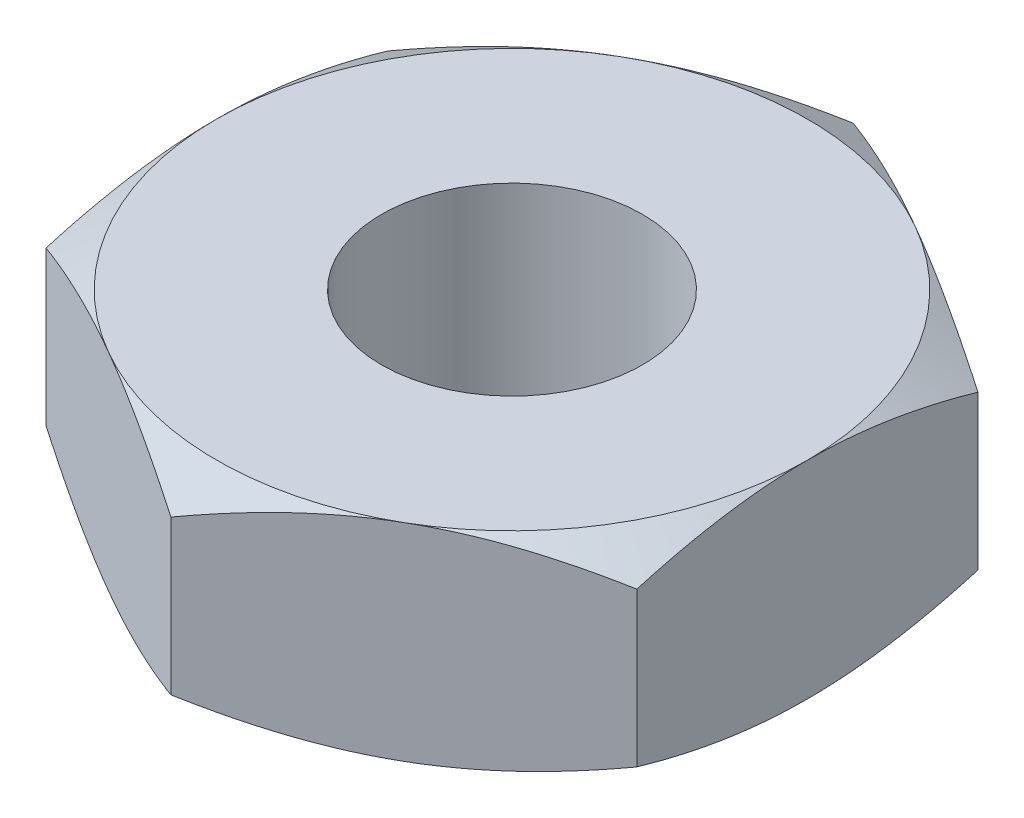
ISO-10303-21;
HEADER;
FILE_DESCRIPTION(('STEP AP214'),'2;1');
FILE_NAME('part.step','',(''),(''),'','','');
FILE_SCHEMA(('AUTOMOTIVE_DESIGN { 1 0 10303 214 1 1 1 1 }'));
ENDSEC;
DATA;
#1=APPLICATION_CONTEXT('core data for automotive mechanical design processes');
#2=APPLICATION_PROTOCOL_DEFINITION('international standard','automotive_design',2000,#1);
#3=PRODUCT_CONTEXT('',#1,'mechanical');
#4=PRODUCT('Part','Part','',(#3));
#5=PRODUCT_RELATED_PRODUCT_CATEGORY('part','',(#4));
#6=PRODUCT_DEFINITION_FORMATION('','',#4);
#7=PRODUCT_DEFINITION_CONTEXT('part definition',#1,'design');
#8=PRODUCT_DEFINITION('design','',#6,#7);
#9=PRODUCT_DEFINITION_SHAPE('','',#8);
#10=(LENGTH_UNIT() NAMED_UNIT(*) SI_UNIT(.MILLI.,.METRE.));
#11=(NAMED_UNIT(*) PLANE_ANGLE_UNIT() SI_UNIT($,.RADIAN.));
#12=(NAMED_UNIT(*) SI_UNIT($,.STERADIAN.) SOLID_ANGLE_UNIT());
#13=UNCERTAINTY_MEASURE_WITH_UNIT(LENGTH_MEASURE(1.E-05),#10,'distance_accuracy_value','');
#14=(GEOMETRIC_REPRESENTATION_CONTEXT(3) GLOBAL_UNCERTAINTY_ASSIGNED_CONTEXT((#13)) GLOBAL_UNIT_ASSIGNED_CONTEXT((#10,
#11,#12)) REPRESENTATION_CONTEXT('',''));
#15=CARTESIAN_POINT('',(0.,0.,0.));
#16=DIRECTION('',(0.,0.,1.));
#17=DIRECTION('',(1.,0.,0.));
#18=AXIS2_PLACEMENT_3D('',#15,#16,#17);
#19=CARTESIAN_POINT('',(-3.96875,1.3890625,-2.29135888084633));
#20=DIRECTION('',(0.,1.,0.));
#21=DIRECTION('',(0.,0.,1.));
#22=AXIS2_PLACEMENT_3D('',#19,#20,#21);
#23=PLANE('',#22);
#24=CARTESIAN_POINT('',(0.,1.3890625,0.));
#25=DIRECTION('',(0.,1.,0.));
#26=DIRECTION('',(0.,0.,1.));
#27=AXIS2_PLACEMENT_3D('',#24,#25,#26);
#28=CIRCLE('',#27,1.7526);
#29=CARTESIAN_POINT('',(0.,1.3890625,1.7526));
#30=VERTEX_POINT('',#29);
#31=EDGE_CURVE('E247',#30,#30,#28,.T.);
#32=ORIENTED_EDGE('',*,*,#31,.F.);
#33=EDGE_LOOP('',(#32));
#34=FACE_BOUND('',#33,.T.);
#35=CARTESIAN_POINT('',(0.,1.3890625,0.));
#36=DIRECTION('',(0.,1.,0.));
#37=DIRECTION('',(0.,0.,1.));
#38=AXIS2_PLACEMENT_3D('',#35,#36,#37);
#39=CIRCLE('',#38,3.96875);
#40=CARTESIAN_POINT('',(-1.984375,1.3890625,3.43703832126949));
#41=VERTEX_POINT('',#40);
#42=CARTESIAN_POINT('',(1.984375,1.3890625,3.43703832126949));
#43=VERTEX_POINT('',#42);
#44=EDGE_CURVE('E306',#41,#43,#39,.T.);
#45=ORIENTED_EDGE('',*,*,#44,.T.);
#46=CARTESIAN_POINT('',(3.96875,1.3890625,0.));
#47=VERTEX_POINT('',#46);
#48=EDGE_CURVE('E309',#43,#47,#39,.T.);
#49=ORIENTED_EDGE('',*,*,#48,.T.);
#50=CARTESIAN_POINT('',(1.984375,1.3890625,-3.43703832126949));
#51=VERTEX_POINT('',#50);
#52=EDGE_CURVE('E316',#47,#51,#39,.T.);
#53=ORIENTED_EDGE('',*,*,#52,.T.);
#54=CARTESIAN_POINT('',(-1.984375,1.3890625,-3.43703832126949));
#55=VERTEX_POINT('',#54);
#56=EDGE_CURVE('E320',#51,#55,#39,.T.);
#57=ORIENTED_EDGE('',*,*,#56,.T.);
#58=CARTESIAN_POINT('',(-3.96875,1.3890625,0.));
#59=VERTEX_POINT('',#58);
#60=EDGE_CURVE('E313',#55,#59,#39,.T.);
#61=ORIENTED_EDGE('',*,*,#60,.T.);
#62=EDGE_CURVE('E308',#59,#41,#39,.T.);
#63=ORIENTED_EDGE('',*,*,#62,.T.);
#64=EDGE_LOOP('',(#45,#49,#53,#57,#61,#63));
#65=FACE_BOUND('',#64,.T.);
#66=ADVANCED_FACE('F43',(#34,#65),#23,.T.);
#67=CARTESIAN_POINT('',(0.,1.3890625,-4.58271776169266));
#68=DIRECTION('',(0.5,0.,0.866025403784438));
#69=DIRECTION('',(0.866025403784439,0.,-0.5));
#70=AXIS2_PLACEMENT_3D('',#67,#68,#69);
#71=PLANE('',#70);
#72=DIRECTION('',(0.,-1.,0.));
#73=VECTOR('',#72,1.);
#74=CARTESIAN_POINT('',(0.,1.3890625,-4.58271776169266));
#75=LINE('',#74,#73);
#76=CARTESIAN_POINT('',(0.,1.034588047513,-4.58271776169266));
#77=VERTEX_POINT('',#76);
#78=CARTESIAN_POINT('',(0.,-1.034588047513,-4.58271776169266));
#79=VERTEX_POINT('',#78);
#80=EDGE_CURVE('E244',#77,#79,#75,.T.);
#81=ORIENTED_EDGE('',*,*,#80,.T.);
#82=CARTESIAN_POINT('',(0.000199999999994845,-1.03452137832671,-4.58283323174649));
#83=CARTESIAN_POINT('',(-0.174205902081162,-1.09267788164553,-4.48213993723168));
#84=CARTESIAN_POINT('',(-0.350117265982856,-1.14556901401833,-4.38057746392952));
#85=CARTESIAN_POINT('',(-0.704986056512743,-1.23789081645719,-4.17569387219009));
#86=CARTESIAN_POINT('',(-0.883949788458087,-1.27728882681341,-4.07236911337627));
#87=CARTESIAN_POINT('',(-1.23965934318176,-1.3386172964786,-3.86700010620323));
#88=CARTESIAN_POINT('',(-1.41635043707329,-1.36095593380879,-3.76498745558155));
#89=CARTESIAN_POINT('',(-1.7705639777928,-1.38762315750667,-3.56048217249653));
#90=CARTESIAN_POINT('',(-1.94808513722976,-1.39197382713073,-3.45799028330875));
#91=CARTESIAN_POINT('',(-2.27979074080338,-1.38292085025305,-3.26647996379381));
#92=CARTESIAN_POINT('',(-2.43402485076553,-1.37174001600782,-3.17743285888894));
#93=CARTESIAN_POINT('',(-2.74148824092523,-1.33630397944562,-2.99991878781428));
#94=CARTESIAN_POINT('',(-2.89471645773984,-1.31203667319011,-2.91145243558892));
#95=CARTESIAN_POINT('',(-3.20281373181354,-1.25137053864588,-2.73357239146588));
#96=CARTESIAN_POINT('',(-3.35764379626361,-1.21471455942136,-2.64418121207699));
#97=CARTESIAN_POINT('',(-3.66499472649982,-1.13151999862476,-2.46673206976942));
#98=CARTESIAN_POINT('',(-3.81751952962953,-1.08500096376703,-2.37867183362439));
#99=CARTESIAN_POINT('',(-3.96895,-1.03452137832671,-2.29124341079249));
#100=B_SPLINE_CURVE_WITH_KNOTS('',3,(#82,#83,#84,#85,#86,#87,#88,#89,#90,#91,#92,#93,#94,#95,
#96,#97,#98,#99),.UNSPECIFIED.,.F.,.F.,(4,2,2,2,2,2,2,2,4),(0.,0.629094460519772,
1.25970103886327,1.87470051579827,2.48894475282133,3.02377031984306,3.55909140824994,
4.1062865060967,4.65240713705191),.UNSPECIFIED.);
#101=CARTESIAN_POINT('',(-1.984375,-1.3890625,-3.43703832126949));
#102=VERTEX_POINT('',#101);
#103=EDGE_CURVE('E66',#79,#102,#100,.T.);
#104=ORIENTED_EDGE('',*,*,#103,.T.);
#105=CARTESIAN_POINT('',(-3.96875,-1.03458804751317,-2.2913588808466));
#106=VERTEX_POINT('',#105);
#107=EDGE_CURVE('E202',#102,#106,#100,.T.);
#108=ORIENTED_EDGE('',*,*,#107,.T.);
#109=DIRECTION('',(0.,-1.,0.));
#110=VECTOR('',#109,1.);
#111=CARTESIAN_POINT('',(-3.96875,1.3890625,-2.29135888084633));
#112=LINE('',#111,#110);
#113=CARTESIAN_POINT('',(-3.96875,1.03458804751317,-2.2913588808466));
#114=VERTEX_POINT('',#113);
#115=EDGE_CURVE('E232',#114,#106,#112,.T.);
#116=ORIENTED_EDGE('',*,*,#115,.F.);
#117=CARTESIAN_POINT('',(0.000199999999994845,1.03452137832671,-4.58283323174649));
#118=CARTESIAN_POINT('',(-0.174205902081162,1.09267788164553,-4.48213993723168));
#119=CARTESIAN_POINT('',(-0.350117265982856,1.14556901401833,-4.38057746392952));
#120=CARTESIAN_POINT('',(-0.704986056512743,1.23789081645719,-4.17569387219009));
#121=CARTESIAN_POINT('',(-0.883949788458087,1.27728882681341,-4.07236911337627));
#122=CARTESIAN_POINT('',(-1.23965934318176,1.3386172964786,-3.86700010620323));
#123=CARTESIAN_POINT('',(-1.41635043707329,1.36095593380879,-3.76498745558155));
#124=CARTESIAN_POINT('',(-1.7705639777928,1.38762315750667,-3.56048217249653));
#125=CARTESIAN_POINT('',(-1.94808513722976,1.39197382713073,-3.45799028330875));
#126=CARTESIAN_POINT('',(-2.27979074080338,1.38292085025305,-3.26647996379381));
#127=CARTESIAN_POINT('',(-2.43402485076553,1.37174001600782,-3.17743285888894));
#128=CARTESIAN_POINT('',(-2.74148824092523,1.33630397944562,-2.99991878781428));
#129=CARTESIAN_POINT('',(-2.89471645773984,1.31203667319011,-2.91145243558892));
#130=CARTESIAN_POINT('',(-3.20281373181354,1.25137053864588,-2.73357239146588));
#131=CARTESIAN_POINT('',(-3.35764379626361,1.21471455942136,-2.64418121207699));
#132=CARTESIAN_POINT('',(-3.66499472649982,1.13151999862476,-2.46673206976942));
#133=CARTESIAN_POINT('',(-3.81751952962953,1.08500096376703,-2.37867183362439));
#134=CARTESIAN_POINT('',(-3.96895,1.03452137832671,-2.29124341079249));
#135=B_SPLINE_CURVE_WITH_KNOTS('',3,(#117,#118,#119,#120,#121,#122,#123,#124,#125,#126,#127,
#128,#129,#130,#131,#132,#133,#134),.UNSPECIFIED.,.F.,.F.,(4,2,2,2,2,2,2,2,4),(0.,
0.629094460519772,1.25970103886327,1.87470051579827,2.48894475282133,3.02377031984306,
3.55909140824994,4.1062865060967,4.65240713705191),.UNSPECIFIED.);
#136=EDGE_CURVE('E254',#55,#114,#135,.T.);
#137=ORIENTED_EDGE('',*,*,#136,.F.);
#138=EDGE_CURVE('E251',#77,#55,#135,.T.);
#139=ORIENTED_EDGE('',*,*,#138,.F.);
#140=EDGE_LOOP('',(#81,#104,#108,#116,#137,#139));
#141=FACE_BOUND('',#140,.T.);
#142=ADVANCED_FACE('F45',(#141),#71,.F.);
#143=CARTESIAN_POINT('',(-3.96875,1.3890625,-2.29135888084633));
#144=DIRECTION('',(1.,0.,0.));
#145=DIRECTION('',(0.,0.,-1.));
#146=AXIS2_PLACEMENT_3D('',#143,#144,#145);
#147=PLANE('',#146);
#148=ORIENTED_EDGE('',*,*,#115,.T.);
#149=CARTESIAN_POINT('',(-3.96875,0.580270643707876,-6.22169695676346));
#150=CARTESIAN_POINT('',(-3.96875,0.495629554498547,-6.04776097042012));
#151=CARTESIAN_POINT('',(-3.96875,0.411781015228386,-5.87343276197247));
#152=CARTESIAN_POINT('',(-3.96875,0.246113557528974,-5.52378352626055));
#153=CARTESIAN_POINT('',(-3.96875,0.164294946503744,-5.34846235350417));
#154=CARTESIAN_POINT('',(-3.96875,0.00273455510915232,-4.99574743703183));
#155=CARTESIAN_POINT('',(-3.96875,-0.0769940637955178,-4.8183476443733));
#156=CARTESIAN_POINT('',(-3.96875,-0.233275940637595,-4.46216001234746));
#157=CARTESIAN_POINT('',(-3.96875,-0.309829344353899,-4.28337223715292));
#158=CARTESIAN_POINT('',(-3.96875,-0.461404283867796,-3.91814940793921));
#159=CARTESIAN_POINT('',(-3.96875,-0.536290207564717,-3.7316577704564));
#160=CARTESIAN_POINT('',(-3.96875,-0.680554504087907,-3.35651758495646));
#161=CARTESIAN_POINT('',(-3.96875,-0.74993226847017,-3.16786880128179));
#162=CARTESIAN_POINT('',(-3.96875,-0.881408126224332,-2.78844599514931));
#163=CARTESIAN_POINT('',(-3.96875,-0.943520384294775,-2.59767692965097));
#164=CARTESIAN_POINT('',(-3.96875,-1.05851662121305,-2.2134031112067));
#165=CARTESIAN_POINT('',(-3.96875,-1.11140343580595,-2.01989921874075));
#166=CARTESIAN_POINT('',(-3.96875,-1.20517636129246,-1.6311091012753));
#167=CARTESIAN_POINT('',(-3.96875,-1.24612852574059,-1.43583910195992));
#168=CARTESIAN_POINT('',(-3.96875,-1.31375702721554,-1.0428024899618));
#169=CARTESIAN_POINT('',(-3.96875,-1.34043487467902,-0.845036143697719));
#170=CARTESIAN_POINT('',(-3.96875,-1.3770403841221,-0.450605512338849));
#171=CARTESIAN_POINT('',(-3.96875,-1.38718865783126,-0.25396221985486));
#172=CARTESIAN_POINT('',(-3.96875,-1.39045976447106,0.139485992218314));
#173=CARTESIAN_POINT('',(-3.96875,-1.38358228756796,0.336290914683681));
#174=CARTESIAN_POINT('',(-3.96875,-1.35810261812635,0.668410754752709));
#175=CARTESIAN_POINT('',(-3.96875,-1.3437432404343,0.804072537555574));
#176=CARTESIAN_POINT('',(-3.96875,-1.30779247207964,1.0744408102038));
#177=CARTESIAN_POINT('',(-3.96875,-1.28620015652866,1.2091471756276));
#178=CARTESIAN_POINT('',(-3.96875,-1.21170483065242,1.61162887315064));
#179=CARTESIAN_POINT('',(-3.96875,-1.14909538893366,1.87762972847311));
#180=CARTESIAN_POINT('',(-3.96875,-1.04002741153514,2.27555191163834));
#181=CARTESIAN_POINT('',(-3.96875,-1.00061037701119,2.40952100703487));
#182=CARTESIAN_POINT('',(-3.96875,-0.917560151569726,2.67615857994853));
#183=CARTESIAN_POINT('',(-3.96875,-0.873926928994568,2.80882704769153));
#184=CARTESIAN_POINT('',(-3.96875,-0.783154734396828,3.07290448457615));
#185=CARTESIAN_POINT('',(-3.96875,-0.736016795290461,3.20431381202589));
#186=CARTESIAN_POINT('',(-3.96875,-0.638802011642293,3.46603416335526));
#187=CARTESIAN_POINT('',(-3.96875,-0.588725228974447,3.5963452102919));
#188=CARTESIAN_POINT('',(-3.96875,-0.452575047627679,3.94088412858893));
#189=CARTESIAN_POINT('',(-3.96875,-0.364374104411038,4.15427038484707));
#190=CARTESIAN_POINT('',(-3.96875,-0.182946985149719,4.57890352123334));
#191=CARTESIAN_POINT('',(-3.96875,-0.0897202959000215,4.79015018024977));
#192=CARTESIAN_POINT('',(-3.96875,0.100589836396979,5.21097578363183));
#193=CARTESIAN_POINT('',(-3.96875,0.197674518443246,5.42055416586365));
#194=CARTESIAN_POINT('',(-3.96875,0.394806200491002,5.83831597781125));
#195=CARTESIAN_POINT('',(-3.96875,0.494853286808515,6.04649936666375));
#196=CARTESIAN_POINT('',(-3.96875,0.69742165401802,6.4620401593694));
#197=CARTESIAN_POINT('',(-3.96875,0.799946395513734,6.66939587286292));
#198=CARTESIAN_POINT('',(-3.96875,1.00685664462163,7.083177791462));
#199=CARTESIAN_POINT('',(-3.96875,1.11124217149255,7.2896039869195));
#200=CARTESIAN_POINT('',(-3.96875,1.42658702639339,7.90765670661576));
#201=CARTESIAN_POINT('',(-3.96875,1.63977745980659,8.3181443926152));
#202=CARTESIAN_POINT('',(-3.96875,2.04807122962612,9.09498840679135));
#203=CARTESIAN_POINT('',(-3.96875,2.24278532373392,9.46155029736983));
#204=CARTESIAN_POINT('',(-3.96875,2.63459143839332,10.1934273187956));
#205=CARTESIAN_POINT('',(-3.96875,2.83168359443524,10.5587423770687));
#206=CARTESIAN_POINT('',(-3.96875,3.22699755433617,11.2872403110954));
#207=CARTESIAN_POINT('',(-3.96875,3.42521369250251,11.6504262661362));
#208=CARTESIAN_POINT('',(-3.96875,3.82300419769019,12.3760186060547));
#209=CARTESIAN_POINT('',(-3.96875,4.02257846210828,12.7384250471593));
#210=CARTESIAN_POINT('',(-3.96875,4.22264849263489,13.1005558551109));
#211=B_SPLINE_CURVE_WITH_KNOTS('',3,(#149,#150,#151,#152,#153,#154,#155,#156,#157,#158,#159,
#160,#161,#162,#163,#164,#165,#166,#167,#168,#169,#170,#171,#172,#173,#174,#175,#176,#177,#178,
#179,#180,#181,#182,#183,#184,#185,#186,#187,#188,#189,#190,#191,#192,#193,#194,#195,#196,#197,
#198,#199,#200,#201,#202,#203,#204,#205,#206,#207,#208,#209,#210),.UNSPECIFIED.,.F.,.F.,(4,2,2,
2,2,2,2,2,2,2,2,2,2,2,2,2,2,2,2,2,2,2,2,2,2,2,2,2,2,2,4),(0.,0.580317532576746,1.16072241618541,
1.74417501419442,2.32760079530033,2.93042926439164,3.53332423092783,4.13502349111168,
4.73653747196744,5.33465617674795,5.93271157908309,6.52271762195252,7.11273440180051,
7.52179616412227,7.93091025386496,8.74954934292227,9.16845446095108,9.58736272461322,
10.006148012592,10.4249244866913,11.1175183219819,11.8101830160883,12.5030719870989,
13.1959811668256,13.8899215612348,14.5838691419566,15.9714733438239,17.2166675132063,
18.4619329658364,19.7031966118937,20.9443675020377),.UNSPECIFIED.);
#212=CARTESIAN_POINT('',(-3.96875,-1.3890625,0.));
#213=VERTEX_POINT('',#212);
#214=EDGE_CURVE('E287',#106,#213,#211,.T.);
#215=ORIENTED_EDGE('',*,*,#214,.T.);
#216=CARTESIAN_POINT('',(-3.96875,-1.034588047513,2.29135888084633));
#217=VERTEX_POINT('',#216);
#218=EDGE_CURVE('E281',#213,#217,#211,.T.);
#219=ORIENTED_EDGE('',*,*,#218,.T.);
#220=DIRECTION('',(0.,-1.,0.));
#221=VECTOR('',#220,1.);
#222=CARTESIAN_POINT('',(-3.96875,1.3890625,2.29135888084633));
#223=LINE('',#222,#221);
#224=CARTESIAN_POINT('',(-3.96875,1.034588047513,2.29135888084633));
#225=VERTEX_POINT('',#224);
#226=EDGE_CURVE('E235',#225,#217,#223,.T.);
#227=ORIENTED_EDGE('',*,*,#226,.F.);
#228=CARTESIAN_POINT('',(-3.96875,-0.580270643707876,-6.22169695676346));
#229=CARTESIAN_POINT('',(-3.96875,-0.495629554498547,-6.04776097042012));
#230=CARTESIAN_POINT('',(-3.96875,-0.411781015228386,-5.87343276197247));
#231=CARTESIAN_POINT('',(-3.96875,-0.246113557528974,-5.52378352626055));
#232=CARTESIAN_POINT('',(-3.96875,-0.164294946503744,-5.34846235350417));
#233=CARTESIAN_POINT('',(-3.96875,-0.00273455510915232,-4.99574743703183));
#234=CARTESIAN_POINT('',(-3.96875,0.0769940637955178,-4.8183476443733));
#235=CARTESIAN_POINT('',(-3.96875,0.233275940637595,-4.46216001234746));
#236=CARTESIAN_POINT('',(-3.96875,0.309829344353899,-4.28337223715292));
#237=CARTESIAN_POINT('',(-3.96875,0.461404283867796,-3.91814940793921));
#238=CARTESIAN_POINT('',(-3.96875,0.536290207564717,-3.7316577704564));
#239=CARTESIAN_POINT('',(-3.96875,0.680554504087907,-3.35651758495646));
#240=CARTESIAN_POINT('',(-3.96875,0.74993226847017,-3.16786880128179));
#241=CARTESIAN_POINT('',(-3.96875,0.881408126224332,-2.78844599514931));
#242=CARTESIAN_POINT('',(-3.96875,0.943520384294775,-2.59767692965097));
#243=CARTESIAN_POINT('',(-3.96875,1.05851662121305,-2.2134031112067));
#244=CARTESIAN_POINT('',(-3.96875,1.11140343580595,-2.01989921874075));
#245=CARTESIAN_POINT('',(-3.96875,1.20517636129246,-1.6311091012753));
#246=CARTESIAN_POINT('',(-3.96875,1.24612852574059,-1.43583910195992));
#247=CARTESIAN_POINT('',(-3.96875,1.31375702721554,-1.0428024899618));
#248=CARTESIAN_POINT('',(-3.96875,1.34043487467902,-0.845036143697719));
#249=CARTESIAN_POINT('',(-3.96875,1.3770403841221,-0.450605512338849));
#250=CARTESIAN_POINT('',(-3.96875,1.38718865783126,-0.25396221985486));
#251=CARTESIAN_POINT('',(-3.96875,1.39045976447106,0.139485992218314));
#252=CARTESIAN_POINT('',(-3.96875,1.38358228756796,0.336290914683681));
#253=CARTESIAN_POINT('',(-3.96875,1.35810261812635,0.668410754752709));
#254=CARTESIAN_POINT('',(-3.96875,1.3437432404343,0.804072537555574));
#255=CARTESIAN_POINT('',(-3.96875,1.30779247207964,1.0744408102038));
#256=CARTESIAN_POINT('',(-3.96875,1.28620015652866,1.2091471756276));
#257=CARTESIAN_POINT('',(-3.96875,1.21170483065242,1.61162887315064));
#258=CARTESIAN_POINT('',(-3.96875,1.14909538893366,1.87762972847311));
#259=CARTESIAN_POINT('',(-3.96875,1.04002741153514,2.27555191163834));
#260=CARTESIAN_POINT('',(-3.96875,1.00061037701119,2.40952100703487));
#261=CARTESIAN_POINT('',(-3.96875,0.917560151569726,2.67615857994853));
#262=CARTESIAN_POINT('',(-3.96875,0.873926928994568,2.80882704769153));
#263=CARTESIAN_POINT('',(-3.96875,0.783154734396828,3.07290448457615));
#264=CARTESIAN_POINT('',(-3.96875,0.736016795290461,3.20431381202589));
#265=CARTESIAN_POINT('',(-3.96875,0.638802011642293,3.46603416335526));
#266=CARTESIAN_POINT('',(-3.96875,0.588725228974447,3.5963452102919));
#267=CARTESIAN_POINT('',(-3.96875,0.452575047627679,3.94088412858893));
#268=CARTESIAN_POINT('',(-3.96875,0.364374104411038,4.15427038484707));
#269=CARTESIAN_POINT('',(-3.96875,0.182946985149719,4.57890352123334));
#270=CARTESIAN_POINT('',(-3.96875,0.0897202959000215,4.79015018024977));
#271=CARTESIAN_POINT('',(-3.96875,-0.100589836396979,5.21097578363183));
#272=CARTESIAN_POINT('',(-3.96875,-0.197674518443246,5.42055416586365));
#273=CARTESIAN_POINT('',(-3.96875,-0.394806200491002,5.83831597781125));
#274=CARTESIAN_POINT('',(-3.96875,-0.494853286808515,6.04649936666375));
#275=CARTESIAN_POINT('',(-3.96875,-0.69742165401802,6.4620401593694));
#276=CARTESIAN_POINT('',(-3.96875,-0.799946395513734,6.66939587286292));
#277=CARTESIAN_POINT('',(-3.96875,-1.00685664462163,7.083177791462));
#278=CARTESIAN_POINT('',(-3.96875,-1.11124217149255,7.2896039869195));
#279=CARTESIAN_POINT('',(-3.96875,-1.42658702639339,7.90765670661576));
#280=CARTESIAN_POINT('',(-3.96875,-1.63977745980659,8.3181443926152));
#281=CARTESIAN_POINT('',(-3.96875,-2.04807122962612,9.09498840679135));
#282=CARTESIAN_POINT('',(-3.96875,-2.24278532373392,9.46155029736983));
#283=CARTESIAN_POINT('',(-3.96875,-2.63459143839332,10.1934273187956));
#284=CARTESIAN_POINT('',(-3.96875,-2.83168359443524,10.5587423770687));
#285=CARTESIAN_POINT('',(-3.96875,-3.22699755433617,11.2872403110954));
#286=CARTESIAN_POINT('',(-3.96875,-3.42521369250251,11.6504262661362));
#287=CARTESIAN_POINT('',(-3.96875,-3.82300419769019,12.3760186060547));
#288=CARTESIAN_POINT('',(-3.96875,-4.02257846210828,12.7384250471593));
#289=CARTESIAN_POINT('',(-3.96875,-4.22264849263489,13.1005558551109));
#290=B_SPLINE_CURVE_WITH_KNOTS('',3,(#228,#229,#230,#231,#232,#233,#234,#235,#236,#237,#238,
#239,#240,#241,#242,#243,#244,#245,#246,#247,#248,#249,#250,#251,#252,#253,#254,#255,#256,#257,
#258,#259,#260,#261,#262,#263,#264,#265,#266,#267,#268,#269,#270,#271,#272,#273,#274,#275,#276,
#277,#278,#279,#280,#281,#282,#283,#284,#285,#286,#287,#288,#289),.UNSPECIFIED.,.F.,.F.,(4,2,2,
2,2,2,2,2,2,2,2,2,2,2,2,2,2,2,2,2,2,2,2,2,2,2,2,2,2,2,4),(0.,0.580317532576746,1.16072241618541,
1.74417501419442,2.32760079530033,2.93042926439164,3.53332423092783,4.13502349111168,
4.73653747196744,5.33465617674795,5.93271157908309,6.52271762195252,7.11273440180051,
7.52179616412227,7.93091025386496,8.74954934292227,9.16845446095108,9.58736272461322,
10.006148012592,10.4249244866913,11.1175183219819,11.8101830160883,12.5030719870989,
13.1959811668256,13.8899215612348,14.5838691419566,15.9714733438239,17.2166675132063,
18.4619329658364,19.7031966118937,20.9443675020377),.UNSPECIFIED.);
#291=EDGE_CURVE('E261',#59,#225,#290,.T.);
#292=ORIENTED_EDGE('',*,*,#291,.F.);
#293=EDGE_CURVE('E260',#114,#59,#290,.T.);
#294=ORIENTED_EDGE('',*,*,#293,.F.);
#295=EDGE_LOOP('',(#148,#215,#219,#227,#292,#294));
#296=FACE_BOUND('',#295,.T.);
#297=ADVANCED_FACE('F274',(#296),#147,.F.);
#298=CARTESIAN_POINT('',(-3.96875,1.3890625,2.29135888084633));
#299=DIRECTION('',(0.5,0.,-0.866025403784439));
#300=DIRECTION('',(-0.866025403784439,0.,-0.5));
#301=AXIS2_PLACEMENT_3D('',#298,#299,#300);
#302=PLANE('',#301);
#303=ORIENTED_EDGE('',*,*,#226,.T.);
#304=CARTESIAN_POINT('',(-3.96895,-1.03452137832671,2.29124341079249));
#305=CARTESIAN_POINT('',(-3.79454409791885,-1.09267788164553,2.39193670530731));
#306=CARTESIAN_POINT('',(-3.61863273401715,-1.14556901401833,2.49349917860946));
#307=CARTESIAN_POINT('',(-3.26376394348726,-1.23789081645719,2.69838277034889));
#308=CARTESIAN_POINT('',(-3.08480021154192,-1.27728882681341,2.80170752916271));
#309=CARTESIAN_POINT('',(-2.72909065681824,-1.3386172964786,3.00707653633575));
#310=CARTESIAN_POINT('',(-2.55239956292672,-1.36095593380879,3.10908918695743));
#311=CARTESIAN_POINT('',(-2.1981860222072,-1.38762315750667,3.31359447004246));
#312=CARTESIAN_POINT('',(-2.02066486277025,-1.39197382713073,3.41608635923024));
#313=CARTESIAN_POINT('',(-1.68895925919662,-1.38292085025305,3.60759667874518));
#314=CARTESIAN_POINT('',(-1.53472514923448,-1.37174001600782,3.69664378365004));
#315=CARTESIAN_POINT('',(-1.22726175907478,-1.33630397944562,3.8741578547247));
#316=CARTESIAN_POINT('',(-1.07403354226016,-1.31203667319011,3.96262420695006));
#317=CARTESIAN_POINT('',(-0.765936268186465,-1.25137053864589,4.1405042510731));
#318=CARTESIAN_POINT('',(-0.611106203736397,-1.21471455942136,4.229895430462));
#319=CARTESIAN_POINT('',(-0.303755273500178,-1.13151999862476,4.40734457276956));
#320=CARTESIAN_POINT('',(-0.151230470370471,-1.08500096376704,4.49540480891459));
#321=CARTESIAN_POINT('',(0.000200000000000396,-1.03452137832671,4.58283323174649));
#322=B_SPLINE_CURVE_WITH_KNOTS('',3,(#304,#305,#306,#307,#308,#309,#310,#311,#312,#313,#314,
#315,#316,#317,#318,#319,#320,#321),.UNSPECIFIED.,.F.,.F.,(4,2,2,2,2,2,2,2,4),(0.,
0.629094460519773,1.25970103886327,1.87470051579827,2.48894475282133,3.02377031984306,
3.55909140824994,4.1062865060967,4.65240713705191),.UNSPECIFIED.);
#323=CARTESIAN_POINT('',(-1.984375,-1.3890625,3.43703832126949));
#324=VERTEX_POINT('',#323);
#325=EDGE_CURVE('E167',#217,#324,#322,.T.);
#326=ORIENTED_EDGE('',*,*,#325,.T.);
#327=CARTESIAN_POINT('',(0.,-1.034588047513,4.58271776169266));
#328=VERTEX_POINT('',#327);
#329=EDGE_CURVE('E151',#324,#328,#322,.T.);
#330=ORIENTED_EDGE('',*,*,#329,.T.);
#331=DIRECTION('',(0.,-1.,0.));
#332=VECTOR('',#331,1.);
#333=CARTESIAN_POINT('',(0.,1.3890625,4.58271776169266));
#334=LINE('',#333,#332);
#335=CARTESIAN_POINT('',(0.,1.034588047513,4.58271776169266));
#336=VERTEX_POINT('',#335);
#337=EDGE_CURVE('E166',#336,#328,#334,.T.);
#338=ORIENTED_EDGE('',*,*,#337,.F.);
#339=CARTESIAN_POINT('',(-3.96895,1.03452137832671,2.29124341079249));
#340=CARTESIAN_POINT('',(-3.79454409791885,1.09267788164553,2.39193670530731));
#341=CARTESIAN_POINT('',(-3.61863273401715,1.14556901401833,2.49349917860946));
#342=CARTESIAN_POINT('',(-3.26376394348726,1.23789081645719,2.69838277034889));
#343=CARTESIAN_POINT('',(-3.08480021154192,1.27728882681341,2.80170752916271));
#344=CARTESIAN_POINT('',(-2.72909065681824,1.3386172964786,3.00707653633575));
#345=CARTESIAN_POINT('',(-2.55239956292672,1.36095593380879,3.10908918695743));
#346=CARTESIAN_POINT('',(-2.1981860222072,1.38762315750667,3.31359447004246));
#347=CARTESIAN_POINT('',(-2.02066486277025,1.39197382713073,3.41608635923024));
#348=CARTESIAN_POINT('',(-1.68895925919662,1.38292085025305,3.60759667874518));
#349=CARTESIAN_POINT('',(-1.53472514923448,1.37174001600782,3.69664378365004));
#350=CARTESIAN_POINT('',(-1.22726175907478,1.33630397944562,3.8741578547247));
#351=CARTESIAN_POINT('',(-1.07403354226016,1.31203667319011,3.96262420695006));
#352=CARTESIAN_POINT('',(-0.765936268186465,1.25137053864589,4.1405042510731));
#353=CARTESIAN_POINT('',(-0.611106203736397,1.21471455942136,4.229895430462));
#354=CARTESIAN_POINT('',(-0.303755273500178,1.13151999862476,4.40734457276956));
#355=CARTESIAN_POINT('',(-0.151230470370471,1.08500096376704,4.49540480891459));
#356=CARTESIAN_POINT('',(0.000200000000000396,1.03452137832671,4.58283323174649));
#357=B_SPLINE_CURVE_WITH_KNOTS('',3,(#339,#340,#341,#342,#343,#344,#345,#346,#347,#348,#349,
#350,#351,#352,#353,#354,#355,#356),.UNSPECIFIED.,.F.,.F.,(4,2,2,2,2,2,2,2,4),(0.,
0.629094460519773,1.25970103886327,1.87470051579827,2.48894475282133,3.02377031984306,
3.55909140824994,4.1062865060967,4.65240713705191),.UNSPECIFIED.);
#358=EDGE_CURVE('E268',#41,#336,#357,.T.);
#359=ORIENTED_EDGE('',*,*,#358,.F.);
#360=EDGE_CURVE('E267',#225,#41,#357,.T.);
#361=ORIENTED_EDGE('',*,*,#360,.F.);
#362=EDGE_LOOP('',(#303,#326,#330,#338,#359,#361));
#363=FACE_BOUND('',#362,.T.);
#364=ADVANCED_FACE('F277',(#363),#302,.F.);
#365=CARTESIAN_POINT('',(0.,1.3890625,4.58271776169266));
#366=DIRECTION('',(-0.5,0.,-0.866025403784438));
#367=DIRECTION('',(-0.866025403784439,0.,0.5));
#368=AXIS2_PLACEMENT_3D('',#365,#366,#367);
#369=PLANE('',#368);
#370=ORIENTED_EDGE('',*,*,#337,.T.);
#371=CARTESIAN_POINT('',(-0.000199999999999565,-1.03452137832671,4.58283323174649));
#372=CARTESIAN_POINT('',(0.174205902081158,-1.09267788164553,4.48213993723168));
#373=CARTESIAN_POINT('',(0.350117265982851,-1.14556901401833,4.38057746392952));
#374=CARTESIAN_POINT('',(0.704986056512738,-1.23789081645719,4.17569387219009));
#375=CARTESIAN_POINT('',(0.883949788458082,-1.27728882681341,4.07236911337627));
#376=CARTESIAN_POINT('',(1.23965934318176,-1.3386172964786,3.86700010620323));
#377=CARTESIAN_POINT('',(1.41635043707328,-1.36095593380879,3.76498745558155));
#378=CARTESIAN_POINT('',(1.7705639777928,-1.38762315750667,3.56048217249653));
#379=CARTESIAN_POINT('',(1.94808513722976,-1.39197382713073,3.45799028330875));
#380=CARTESIAN_POINT('',(2.27979074080338,-1.38292085025305,3.26647996379381));
#381=CARTESIAN_POINT('',(2.43402485076552,-1.37174001600782,3.17743285888894));
#382=CARTESIAN_POINT('',(2.74148824092523,-1.33630397944563,2.99991878781428));
#383=CARTESIAN_POINT('',(2.89471645773984,-1.31203667319011,2.91145243558892));
#384=CARTESIAN_POINT('',(3.20281373181354,-1.25137053864589,2.73357239146588));
#385=CARTESIAN_POINT('',(3.3576437962636,-1.21471455942137,2.64418121207698));
#386=CARTESIAN_POINT('',(3.66499472649982,-1.13151999862477,2.46673206976942));
#387=CARTESIAN_POINT('',(3.81751952962953,-1.08500096376704,2.37867183362439));
#388=CARTESIAN_POINT('',(3.96895,-1.03452137832671,2.29124341079249));
#389=B_SPLINE_CURVE_WITH_KNOTS('',3,(#371,#372,#373,#374,#375,#376,#377,#378,#379,#380,#381,
#382,#383,#384,#385,#386,#387,#388),.UNSPECIFIED.,.F.,.F.,(4,2,2,2,2,2,2,2,4),(0.,
0.629094460519772,1.25970103886327,1.87470051579827,2.48894475282133,3.02377031984306,
3.55909140824994,4.1062865060967,4.65240713705191),.UNSPECIFIED.);
#390=CARTESIAN_POINT('',(1.984375,-1.3890625,3.43703832126949));
#391=VERTEX_POINT('',#390);
#392=EDGE_CURVE('E145',#328,#391,#389,.T.);
#393=ORIENTED_EDGE('',*,*,#392,.T.);
#394=CARTESIAN_POINT('',(3.96875,-1.034588047513,2.29135888084633));
#395=VERTEX_POINT('',#394);
#396=EDGE_CURVE('E133',#391,#395,#389,.T.);
#397=ORIENTED_EDGE('',*,*,#396,.T.);
#398=DIRECTION('',(0.,-1.,0.));
#399=VECTOR('',#398,1.);
#400=CARTESIAN_POINT('',(3.96875,1.3890625,2.29135888084633));
#401=LINE('',#400,#399);
#402=CARTESIAN_POINT('',(3.96875,1.034588047513,2.29135888084633));
#403=VERTEX_POINT('',#402);
#404=EDGE_CURVE('E239',#403,#395,#401,.T.);
#405=ORIENTED_EDGE('',*,*,#404,.F.);
#406=CARTESIAN_POINT('',(-0.000199999999999565,1.03452137832671,4.58283323174649));
#407=CARTESIAN_POINT('',(0.174205902081158,1.09267788164553,4.48213993723168));
#408=CARTESIAN_POINT('',(0.350117265982851,1.14556901401833,4.38057746392952));
#409=CARTESIAN_POINT('',(0.704986056512738,1.23789081645719,4.17569387219009));
#410=CARTESIAN_POINT('',(0.883949788458082,1.27728882681341,4.07236911337627));
#411=CARTESIAN_POINT('',(1.23965934318176,1.3386172964786,3.86700010620323));
#412=CARTESIAN_POINT('',(1.41635043707328,1.36095593380879,3.76498745558155));
#413=CARTESIAN_POINT('',(1.7705639777928,1.38762315750667,3.56048217249653));
#414=CARTESIAN_POINT('',(1.94808513722976,1.39197382713073,3.45799028330875));
#415=CARTESIAN_POINT('',(2.27979074080338,1.38292085025305,3.26647996379381));
#416=CARTESIAN_POINT('',(2.43402485076552,1.37174001600782,3.17743285888894));
#417=CARTESIAN_POINT('',(2.74148824092523,1.33630397944563,2.99991878781428));
#418=CARTESIAN_POINT('',(2.89471645773984,1.31203667319011,2.91145243558892));
#419=CARTESIAN_POINT('',(3.20281373181354,1.25137053864589,2.73357239146588));
#420=CARTESIAN_POINT('',(3.3576437962636,1.21471455942137,2.64418121207698));
#421=CARTESIAN_POINT('',(3.66499472649982,1.13151999862477,2.46673206976942));
#422=CARTESIAN_POINT('',(3.81751952962953,1.08500096376704,2.37867183362439));
#423=CARTESIAN_POINT('',(3.96895,1.03452137832671,2.29124341079249));
#424=B_SPLINE_CURVE_WITH_KNOTS('',3,(#406,#407,#408,#409,#410,#411,#412,#413,#414,#415,#416,
#417,#418,#419,#420,#421,#422,#423),.UNSPECIFIED.,.F.,.F.,(4,2,2,2,2,2,2,2,4),(0.,
0.629094460519772,1.25970103886327,1.87470051579827,2.48894475282133,3.02377031984306,
3.55909140824994,4.1062865060967,4.65240713705191),.UNSPECIFIED.);
#425=EDGE_CURVE('E338',#43,#403,#424,.T.);
#426=ORIENTED_EDGE('',*,*,#425,.F.);
#427=EDGE_CURVE('E340',#336,#43,#424,.T.);
#428=ORIENTED_EDGE('',*,*,#427,.F.);
#429=EDGE_LOOP('',(#370,#393,#397,#405,#426,#428));
#430=FACE_BOUND('',#429,.T.);
#431=ADVANCED_FACE('F163',(#430),#369,.F.);
#432=CARTESIAN_POINT('',(3.96875,1.3890625,2.29135888084633));
#433=DIRECTION('',(-1.,0.,0.));
#434=DIRECTION('',(0.,0.,1.));
#435=AXIS2_PLACEMENT_3D('',#432,#433,#434);
#436=PLANE('',#435);
#437=ORIENTED_EDGE('',*,*,#404,.T.);
#438=CARTESIAN_POINT('',(3.96875,0.580270643707873,-6.22169695676345));
#439=CARTESIAN_POINT('',(3.96875,0.495629554498545,-6.04776097042012));
#440=CARTESIAN_POINT('',(3.96875,0.411781015228384,-5.87343276197247));
#441=CARTESIAN_POINT('',(3.96875,0.246113557528972,-5.52378352626055));
#442=CARTESIAN_POINT('',(3.96875,0.164294946503741,-5.34846235350417));
#443=CARTESIAN_POINT('',(3.96875,0.00273455510914979,-4.99574743703183));
#444=CARTESIAN_POINT('',(3.96875,-0.07699406379552,-4.8183476443733));
#445=CARTESIAN_POINT('',(3.96875,-0.233275940637597,-4.46216001234746));
#446=CARTESIAN_POINT('',(3.96875,-0.309829344353901,-4.28337223715292));
#447=CARTESIAN_POINT('',(3.96875,-0.461404283867798,-3.91814940793921));
#448=CARTESIAN_POINT('',(3.96875,-0.536290207564718,-3.7316577704564));
#449=CARTESIAN_POINT('',(3.96875,-0.680554504087908,-3.35651758495646));
#450=CARTESIAN_POINT('',(3.96875,-0.749932268470171,-3.16786880128179));
#451=CARTESIAN_POINT('',(3.96875,-0.881408126224334,-2.78844599514931));
#452=CARTESIAN_POINT('',(3.96875,-0.943520384294777,-2.59767692965097));
#453=CARTESIAN_POINT('',(3.96875,-1.05851662121305,-2.2134031112067));
#454=CARTESIAN_POINT('',(3.96875,-1.11140343580595,-2.01989921874075));
#455=CARTESIAN_POINT('',(3.96875,-1.20517636129246,-1.6311091012753));
#456=CARTESIAN_POINT('',(3.96875,-1.24612852574059,-1.43583910195992));
#457=CARTESIAN_POINT('',(3.96875,-1.31375702721554,-1.04280248996181));
#458=CARTESIAN_POINT('',(3.96875,-1.34043487467902,-0.845036143697721));
#459=CARTESIAN_POINT('',(3.96875,-1.3770403841221,-0.45060551233885));
#460=CARTESIAN_POINT('',(3.96875,-1.38718865783126,-0.253962219854862));
#461=CARTESIAN_POINT('',(3.96875,-1.39045976447106,0.139485992218312));
#462=CARTESIAN_POINT('',(3.96875,-1.38358228756796,0.336290914683679));
#463=CARTESIAN_POINT('',(3.96875,-1.35810261812635,0.668410754752706));
#464=CARTESIAN_POINT('',(3.96875,-1.3437432404343,0.804072537555571));
#465=CARTESIAN_POINT('',(3.96875,-1.30779247207965,1.0744408102038));
#466=CARTESIAN_POINT('',(3.96875,-1.28620015652867,1.20914717562759));
#467=CARTESIAN_POINT('',(3.96875,-1.21170483065242,1.61162887315064));
#468=CARTESIAN_POINT('',(3.96875,-1.14909538893366,1.87762972847311));
#469=CARTESIAN_POINT('',(3.96875,-1.04002741153514,2.27555191163833));
#470=CARTESIAN_POINT('',(3.96875,-1.00061037701119,2.40952100703487));
#471=CARTESIAN_POINT('',(3.96875,-0.917560151569728,2.67615857994852));
#472=CARTESIAN_POINT('',(3.96875,-0.873926928994571,2.80882704769152));
#473=CARTESIAN_POINT('',(3.96875,-0.783154734396831,3.07290448457615));
#474=CARTESIAN_POINT('',(3.96875,-0.736016795290464,3.20431381202589));
#475=CARTESIAN_POINT('',(3.96875,-0.638802011642296,3.46603416335525));
#476=CARTESIAN_POINT('',(3.96875,-0.588725228974449,3.59634521029189));
#477=CARTESIAN_POINT('',(3.96875,-0.452575047627682,3.94088412858893));
#478=CARTESIAN_POINT('',(3.96875,-0.364374104411041,4.15427038484706));
#479=CARTESIAN_POINT('',(3.96875,-0.182946985149722,4.57890352123334));
#480=CARTESIAN_POINT('',(3.96875,-0.0897202959000244,4.79015018024977));
#481=CARTESIAN_POINT('',(3.96875,0.100589836396976,5.21097578363183));
#482=CARTESIAN_POINT('',(3.96875,0.197674518443243,5.42055416586364));
#483=CARTESIAN_POINT('',(3.96875,0.394806200490999,5.83831597781124));
#484=CARTESIAN_POINT('',(3.96875,0.494853286808512,6.04649936666374));
#485=CARTESIAN_POINT('',(3.96875,0.697421654018017,6.46204015936939));
#486=CARTESIAN_POINT('',(3.96875,0.799946395513731,6.66939587286292));
#487=CARTESIAN_POINT('',(3.96875,1.00685664462163,7.08317779146199));
#488=CARTESIAN_POINT('',(3.96875,1.11124217149255,7.28960398691949));
#489=CARTESIAN_POINT('',(3.96875,1.42658702639339,7.90765670661576));
#490=CARTESIAN_POINT('',(3.96875,1.63977745980658,8.31814439261519));
#491=CARTESIAN_POINT('',(3.96875,2.04807122962612,9.09498840679135));
#492=CARTESIAN_POINT('',(3.96875,2.24278532373391,9.46155029736982));
#493=CARTESIAN_POINT('',(3.96875,2.63459143839332,10.1934273187956));
#494=CARTESIAN_POINT('',(3.96875,2.83168359443524,10.5587423770687));
#495=CARTESIAN_POINT('',(3.96875,3.22699755433616,11.2872403110954));
#496=CARTESIAN_POINT('',(3.96875,3.42521369250251,11.6504262661362));
#497=CARTESIAN_POINT('',(3.96875,3.82300419769018,12.3760186060547));
#498=CARTESIAN_POINT('',(3.96875,4.02257846210827,12.7384250471593));
#499=CARTESIAN_POINT('',(3.96875000000001,4.22264849263489,13.1005558551109));
#500=B_SPLINE_CURVE_WITH_KNOTS('',3,(#438,#439,#440,#441,#442,#443,#444,#445,#446,#447,#448,
#449,#450,#451,#452,#453,#454,#455,#456,#457,#458,#459,#460,#461,#462,#463,#464,#465,#466,#467,
#468,#469,#470,#471,#472,#473,#474,#475,#476,#477,#478,#479,#480,#481,#482,#483,#484,#485,#486,
#487,#488,#489,#490,#491,#492,#493,#494,#495,#496,#497,#498,#499),.UNSPECIFIED.,.F.,.F.,(4,2,2,
2,2,2,2,2,2,2,2,2,2,2,2,2,2,2,2,2,2,2,2,2,2,2,2,2,2,2,4),(0.,0.580317532576745,1.16072241618541,
1.74417501419442,2.32760079530033,2.93042926439164,3.53332423092783,4.13502349111168,
4.73653747196744,5.33465617674795,5.93271157908309,6.52271762195251,7.11273440180051,
7.52179616412226,7.93091025386496,8.74954934292227,9.16845446095107,9.58736272461321,
10.0061480125919,10.4249244866913,11.1175183219819,11.8101830160883,12.5030719870989,
13.1959811668256,13.8899215612347,14.5838691419566,15.9714733438239,17.2166675132063,
18.4619329658364,19.7031966118937,20.9443675020377),.UNSPECIFIED.);
#501=CARTESIAN_POINT('',(3.96875,-1.3890625,0.));
#502=VERTEX_POINT('',#501);
#503=EDGE_CURVE('E140',#395,#502,#500,.F.);
#504=ORIENTED_EDGE('',*,*,#503,.T.);
#505=CARTESIAN_POINT('',(3.96875,-1.034588047513,-2.29135888084633));
#506=VERTEX_POINT('',#505);
#507=EDGE_CURVE('E176',#502,#506,#500,.F.);
#508=ORIENTED_EDGE('',*,*,#507,.T.);
#509=DIRECTION('',(0.,-1.,0.));
#510=VECTOR('',#509,1.);
#511=CARTESIAN_POINT('',(3.96875,1.3890625,-2.29135888084633));
#512=LINE('',#511,#510);
#513=CARTESIAN_POINT('',(3.96875,1.034588047513,-2.29135888084633));
#514=VERTEX_POINT('',#513);
#515=EDGE_CURVE('E241',#514,#506,#512,.T.);
#516=ORIENTED_EDGE('',*,*,#515,.F.);
#517=CARTESIAN_POINT('',(3.96875,-0.580270643707873,-6.22169695676345));
#518=CARTESIAN_POINT('',(3.96875,-0.495629554498545,-6.04776097042012));
#519=CARTESIAN_POINT('',(3.96875,-0.411781015228384,-5.87343276197247));
#520=CARTESIAN_POINT('',(3.96875,-0.246113557528972,-5.52378352626055));
#521=CARTESIAN_POINT('',(3.96875,-0.164294946503741,-5.34846235350417));
#522=CARTESIAN_POINT('',(3.96875,-0.00273455510914979,-4.99574743703183));
#523=CARTESIAN_POINT('',(3.96875,0.07699406379552,-4.8183476443733));
#524=CARTESIAN_POINT('',(3.96875,0.233275940637597,-4.46216001234746));
#525=CARTESIAN_POINT('',(3.96875,0.309829344353901,-4.28337223715292));
#526=CARTESIAN_POINT('',(3.96875,0.461404283867798,-3.91814940793921));
#527=CARTESIAN_POINT('',(3.96875,0.536290207564718,-3.7316577704564));
#528=CARTESIAN_POINT('',(3.96875,0.680554504087908,-3.35651758495646));
#529=CARTESIAN_POINT('',(3.96875,0.749932268470171,-3.16786880128179));
#530=CARTESIAN_POINT('',(3.96875,0.881408126224334,-2.78844599514931));
#531=CARTESIAN_POINT('',(3.96875,0.943520384294777,-2.59767692965097));
#532=CARTESIAN_POINT('',(3.96875,1.05851662121305,-2.2134031112067));
#533=CARTESIAN_POINT('',(3.96875,1.11140343580595,-2.01989921874075));
#534=CARTESIAN_POINT('',(3.96875,1.20517636129246,-1.6311091012753));
#535=CARTESIAN_POINT('',(3.96875,1.24612852574059,-1.43583910195992));
#536=CARTESIAN_POINT('',(3.96875,1.31375702721554,-1.04280248996181));
#537=CARTESIAN_POINT('',(3.96875,1.34043487467902,-0.845036143697721));
#538=CARTESIAN_POINT('',(3.96875,1.3770403841221,-0.45060551233885));
#539=CARTESIAN_POINT('',(3.96875,1.38718865783126,-0.253962219854862));
#540=CARTESIAN_POINT('',(3.96875,1.39045976447106,0.139485992218312));
#541=CARTESIAN_POINT('',(3.96875,1.38358228756796,0.336290914683679));
#542=CARTESIAN_POINT('',(3.96875,1.35810261812635,0.668410754752706));
#543=CARTESIAN_POINT('',(3.96875,1.3437432404343,0.804072537555571));
#544=CARTESIAN_POINT('',(3.96875,1.30779247207965,1.0744408102038));
#545=CARTESIAN_POINT('',(3.96875,1.28620015652867,1.20914717562759));
#546=CARTESIAN_POINT('',(3.96875,1.21170483065242,1.61162887315064));
#547=CARTESIAN_POINT('',(3.96875,1.14909538893366,1.87762972847311));
#548=CARTESIAN_POINT('',(3.96875,1.04002741153514,2.27555191163833));
#549=CARTESIAN_POINT('',(3.96875,1.00061037701119,2.40952100703487));
#550=CARTESIAN_POINT('',(3.96875,0.917560151569728,2.67615857994852));
#551=CARTESIAN_POINT('',(3.96875,0.873926928994571,2.80882704769152));
#552=CARTESIAN_POINT('',(3.96875,0.783154734396831,3.07290448457615));
#553=CARTESIAN_POINT('',(3.96875,0.736016795290464,3.20431381202589));
#554=CARTESIAN_POINT('',(3.96875,0.638802011642296,3.46603416335525));
#555=CARTESIAN_POINT('',(3.96875,0.588725228974449,3.59634521029189));
#556=CARTESIAN_POINT('',(3.96875,0.452575047627682,3.94088412858893));
#557=CARTESIAN_POINT('',(3.96875,0.364374104411041,4.15427038484706));
#558=CARTESIAN_POINT('',(3.96875,0.182946985149722,4.57890352123334));
#559=CARTESIAN_POINT('',(3.96875,0.0897202959000244,4.79015018024977));
#560=CARTESIAN_POINT('',(3.96875,-0.100589836396976,5.21097578363183));
#561=CARTESIAN_POINT('',(3.96875,-0.197674518443243,5.42055416586364));
#562=CARTESIAN_POINT('',(3.96875,-0.394806200490999,5.83831597781124));
#563=CARTESIAN_POINT('',(3.96875,-0.494853286808512,6.04649936666374));
#564=CARTESIAN_POINT('',(3.96875,-0.697421654018017,6.46204015936939));
#565=CARTESIAN_POINT('',(3.96875,-0.799946395513731,6.66939587286292));
#566=CARTESIAN_POINT('',(3.96875,-1.00685664462163,7.08317779146199));
#567=CARTESIAN_POINT('',(3.96875,-1.11124217149255,7.28960398691949));
#568=CARTESIAN_POINT('',(3.96875,-1.42658702639339,7.90765670661576));
#569=CARTESIAN_POINT('',(3.96875,-1.63977745980658,8.31814439261519));
#570=CARTESIAN_POINT('',(3.96875,-2.04807122962612,9.09498840679135));
#571=CARTESIAN_POINT('',(3.96875,-2.24278532373391,9.46155029736982));
#572=CARTESIAN_POINT('',(3.96875,-2.63459143839332,10.1934273187956));
#573=CARTESIAN_POINT('',(3.96875,-2.83168359443524,10.5587423770687));
#574=CARTESIAN_POINT('',(3.96875,-3.22699755433616,11.2872403110954));
#575=CARTESIAN_POINT('',(3.96875,-3.42521369250251,11.6504262661362));
#576=CARTESIAN_POINT('',(3.96875,-3.82300419769018,12.3760186060547));
#577=CARTESIAN_POINT('',(3.96875,-4.02257846210827,12.7384250471593));
#578=CARTESIAN_POINT('',(3.96875000000001,-4.22264849263489,13.1005558551109));
#579=B_SPLINE_CURVE_WITH_KNOTS('',3,(#517,#518,#519,#520,#521,#522,#523,#524,#525,#526,#527,
#528,#529,#530,#531,#532,#533,#534,#535,#536,#537,#538,#539,#540,#541,#542,#543,#544,#545,#546,
#547,#548,#549,#550,#551,#552,#553,#554,#555,#556,#557,#558,#559,#560,#561,#562,#563,#564,#565,
#566,#567,#568,#569,#570,#571,#572,#573,#574,#575,#576,#577,#578),.UNSPECIFIED.,.F.,.F.,(4,2,2,
2,2,2,2,2,2,2,2,2,2,2,2,2,2,2,2,2,2,2,2,2,2,2,2,2,2,2,4),(0.,0.580317532576745,1.16072241618541,
1.74417501419442,2.32760079530033,2.93042926439164,3.53332423092783,4.13502349111168,
4.73653747196744,5.33465617674795,5.93271157908309,6.52271762195251,7.11273440180051,
7.52179616412226,7.93091025386496,8.74954934292227,9.16845446095107,9.58736272461321,
10.0061480125919,10.4249244866913,11.1175183219819,11.8101830160883,12.5030719870989,
13.1959811668256,13.8899215612347,14.5838691419566,15.9714733438239,17.2166675132063,
18.4619329658364,19.7031966118937,20.9443675020377),.UNSPECIFIED.);
#580=EDGE_CURVE('E315',#47,#514,#579,.F.);
#581=ORIENTED_EDGE('',*,*,#580,.F.);
#582=EDGE_CURVE('E319',#403,#47,#579,.F.);
#583=ORIENTED_EDGE('',*,*,#582,.F.);
#584=EDGE_LOOP('',(#437,#504,#508,#516,#581,#583));
#585=FACE_BOUND('',#584,.T.);
#586=ADVANCED_FACE('F221',(#585),#436,.F.);
#587=CARTESIAN_POINT('',(3.96875,1.3890625,-2.29135888084633));
#588=DIRECTION('',(-0.5,0.,0.866025403784439));
#589=DIRECTION('',(0.866025403784439,0.,0.5));
#590=AXIS2_PLACEMENT_3D('',#587,#588,#589);
#591=PLANE('',#590);
#592=ORIENTED_EDGE('',*,*,#515,.T.);
#593=CARTESIAN_POINT('',(3.96895,-1.03452137832671,-2.29124341079249));
#594=CARTESIAN_POINT('',(3.79454409791884,-1.09267788164553,-2.39193670530731));
#595=CARTESIAN_POINT('',(3.61863273401715,-1.14556901401833,-2.49349917860946));
#596=CARTESIAN_POINT('',(3.26376394348726,-1.23789081645719,-2.69838277034889));
#597=CARTESIAN_POINT('',(3.08480021154192,-1.27728882681341,-2.80170752916271));
#598=CARTESIAN_POINT('',(2.72909065681824,-1.3386172964786,-3.00707653633575));
#599=CARTESIAN_POINT('',(2.55239956292672,-1.36095593380879,-3.10908918695743));
#600=CARTESIAN_POINT('',(2.1981860222072,-1.38762315750667,-3.31359447004245));
#601=CARTESIAN_POINT('',(2.02066486277024,-1.39197382713073,-3.41608635923023));
#602=CARTESIAN_POINT('',(1.68895925919662,-1.38292085025305,-3.60759667874517));
#603=CARTESIAN_POINT('',(1.53472514923448,-1.37174001600782,-3.69664378365004));
#604=CARTESIAN_POINT('',(1.22726175907477,-1.33630397944563,-3.8741578547247));
#605=CARTESIAN_POINT('',(1.07403354226016,-1.31203667319011,-3.96262420695006));
#606=CARTESIAN_POINT('',(0.765936268186461,-1.25137053864589,-4.1405042510731));
#607=CARTESIAN_POINT('',(0.611106203736393,-1.21471455942136,-4.229895430462));
#608=CARTESIAN_POINT('',(0.303755273500174,-1.13151999862477,-4.40734457276956));
#609=CARTESIAN_POINT('',(0.151230470370466,-1.08500096376704,-4.49540480891459));
#610=CARTESIAN_POINT('',(-0.000200000000005552,-1.03452137832671,-4.58283323174649));
#611=B_SPLINE_CURVE_WITH_KNOTS('',3,(#593,#594,#595,#596,#597,#598,#599,#600,#601,#602,#603,
#604,#605,#606,#607,#608,#609,#610),.UNSPECIFIED.,.F.,.F.,(4,2,2,2,2,2,2,2,4),(0.,
0.629094460519772,1.25970103886327,1.87470051579826,2.48894475282133,3.02377031984306,
3.55909140824994,4.1062865060967,4.65240713705191),.UNSPECIFIED.);
#612=CARTESIAN_POINT('',(1.984375,-1.3890625,-3.43703832126949));
#613=VERTEX_POINT('',#612);
#614=EDGE_CURVE('E216',#506,#613,#611,.T.);
#615=ORIENTED_EDGE('',*,*,#614,.T.);
#616=EDGE_CURVE('E160',#613,#79,#611,.T.);
#617=ORIENTED_EDGE('',*,*,#616,.T.);
#618=ORIENTED_EDGE('',*,*,#80,.F.);
#619=CARTESIAN_POINT('',(3.96895,1.03452137832671,-2.29124341079249));
#620=CARTESIAN_POINT('',(3.79454409791884,1.09267788164553,-2.39193670530731));
#621=CARTESIAN_POINT('',(3.61863273401715,1.14556901401833,-2.49349917860946));
#622=CARTESIAN_POINT('',(3.26376394348726,1.23789081645719,-2.69838277034889));
#623=CARTESIAN_POINT('',(3.08480021154192,1.27728882681341,-2.80170752916271));
#624=CARTESIAN_POINT('',(2.72909065681824,1.3386172964786,-3.00707653633575));
#625=CARTESIAN_POINT('',(2.55239956292672,1.36095593380879,-3.10908918695743));
#626=CARTESIAN_POINT('',(2.1981860222072,1.38762315750667,-3.31359447004245));
#627=CARTESIAN_POINT('',(2.02066486277024,1.39197382713073,-3.41608635923023));
#628=CARTESIAN_POINT('',(1.68895925919662,1.38292085025305,-3.60759667874517));
#629=CARTESIAN_POINT('',(1.53472514923448,1.37174001600782,-3.69664378365004));
#630=CARTESIAN_POINT('',(1.22726175907477,1.33630397944563,-3.8741578547247));
#631=CARTESIAN_POINT('',(1.07403354226016,1.31203667319011,-3.96262420695006));
#632=CARTESIAN_POINT('',(0.765936268186461,1.25137053864589,-4.1405042510731));
#633=CARTESIAN_POINT('',(0.611106203736393,1.21471455942136,-4.229895430462));
#634=CARTESIAN_POINT('',(0.303755273500174,1.13151999862477,-4.40734457276956));
#635=CARTESIAN_POINT('',(0.151230470370466,1.08500096376704,-4.49540480891459));
#636=CARTESIAN_POINT('',(-0.000200000000005552,1.03452137832671,-4.58283323174649));
#637=B_SPLINE_CURVE_WITH_KNOTS('',3,(#619,#620,#621,#622,#623,#624,#625,#626,#627,#628,#629,
#630,#631,#632,#633,#634,#635,#636),.UNSPECIFIED.,.F.,.F.,(4,2,2,2,2,2,2,2,4),(0.,
0.629094460519772,1.25970103886327,1.87470051579826,2.48894475282133,3.02377031984306,
3.55909140824994,4.1062865060967,4.65240713705191),.UNSPECIFIED.);
#638=EDGE_CURVE('E226',#51,#77,#637,.T.);
#639=ORIENTED_EDGE('',*,*,#638,.F.);
#640=EDGE_CURVE('E155',#514,#51,#637,.T.);
#641=ORIENTED_EDGE('',*,*,#640,.F.);
#642=EDGE_LOOP('',(#592,#615,#617,#618,#639,#641));
#643=FACE_BOUND('',#642,.T.);
#644=ADVANCED_FACE('F217',(#643),#591,.F.);
#645=CARTESIAN_POINT('',(-3.96875,-1.3890625,-2.29135888084633));
#646=DIRECTION('',(0.,1.,0.));
#647=DIRECTION('',(0.,0.,1.));
#648=AXIS2_PLACEMENT_3D('',#645,#646,#647);
#649=PLANE('',#648);
#650=CARTESIAN_POINT('',(0.,-1.3890625,0.));
#651=DIRECTION('',(0.,1.,0.));
#652=DIRECTION('',(0.,0.,1.));
#653=AXIS2_PLACEMENT_3D('',#650,#651,#652);
#654=CIRCLE('',#653,3.96875);
#655=EDGE_CURVE('E48',#391,#324,#654,.F.);
#656=ORIENTED_EDGE('',*,*,#655,.T.);
#657=EDGE_CURVE('E12',#324,#213,#654,.F.);
#658=ORIENTED_EDGE('',*,*,#657,.T.);
#659=EDGE_CURVE('E53',#213,#102,#654,.F.);
#660=ORIENTED_EDGE('',*,*,#659,.T.);
#661=EDGE_CURVE('E297',#102,#613,#654,.F.);
#662=ORIENTED_EDGE('',*,*,#661,.T.);
#663=EDGE_CURVE('E154',#613,#502,#654,.F.);
#664=ORIENTED_EDGE('',*,*,#663,.T.);
#665=CARTESIAN_POINT('',(0.,-1.3890625,0.));
#666=DIRECTION('',(0.,1.,0.));
#667=DIRECTION('',(0.,0.,1.));
#668=AXIS2_PLACEMENT_3D('',#665,#666,#667);
#669=CIRCLE('',#668,3.96875);
#670=EDGE_CURVE('E137',#391,#502,#669,.T.);
#671=ORIENTED_EDGE('',*,*,#670,.F.);
#672=EDGE_LOOP('',(#656,#658,#660,#662,#664,#671));
#673=FACE_BOUND('',#672,.T.);
#674=CARTESIAN_POINT('',(0.,-1.3890625,0.));
#675=DIRECTION('',(0.,1.,0.));
#676=DIRECTION('',(0.,0.,1.));
#677=AXIS2_PLACEMENT_3D('',#674,#675,#676);
#678=CIRCLE('',#677,1.7526);
#679=CARTESIAN_POINT('',(0.,-1.3890625,1.7526));
#680=VERTEX_POINT('',#679);
#681=EDGE_CURVE('E248',#680,#680,#678,.T.);
#682=ORIENTED_EDGE('',*,*,#681,.T.);
#683=EDGE_LOOP('',(#682));
#684=FACE_BOUND('',#683,.T.);
#685=ADVANCED_FACE('F156',(#673,#684),#649,.F.);
#686=CARTESIAN_POINT('',(0.,1.3890625,0.));
#687=DIRECTION('',(0.,-1.,0.));
#688=DIRECTION('',(0.,0.,-1.));
#689=AXIS2_PLACEMENT_3D('',#686,#687,#688);
#690=CYLINDRICAL_SURFACE('',#689,1.7526);
#691=ORIENTED_EDGE('',*,*,#31,.T.);
#692=EDGE_LOOP('',(#691));
#693=FACE_BOUND('',#692,.T.);
#694=ORIENTED_EDGE('',*,*,#681,.F.);
#695=EDGE_LOOP('',(#694));
#696=FACE_BOUND('',#695,.T.);
#697=ADVANCED_FACE('F354',(#693,#696),#690,.F.);
#698=CARTESIAN_POINT('',(0.,1.3890625,0.));
#699=DIRECTION('',(0.,-1.,0.));
#700=DIRECTION('',(0.,0.,1.));
#701=AXIS2_PLACEMENT_3D('',#698,#699,#700);
#702=CONICAL_SURFACE('',#701,3.96875,1.0471975511966);
#703=ORIENTED_EDGE('',*,*,#138,.T.);
#704=ORIENTED_EDGE('',*,*,#56,.F.);
#705=ORIENTED_EDGE('',*,*,#638,.T.);
#706=EDGE_LOOP('',(#703,#704,#705));
#707=FACE_BOUND('',#706,.T.);
#708=ADVANCED_FACE('F196',(#707),#702,.T.);
#709=ORIENTED_EDGE('',*,*,#580,.T.);
#710=ORIENTED_EDGE('',*,*,#640,.T.);
#711=ORIENTED_EDGE('',*,*,#52,.F.);
#712=EDGE_LOOP('',(#709,#710,#711));
#713=FACE_BOUND('',#712,.T.);
#714=ADVANCED_FACE('F348',(#713),#702,.T.);
#715=ORIENTED_EDGE('',*,*,#425,.T.);
#716=ORIENTED_EDGE('',*,*,#582,.T.);
#717=ORIENTED_EDGE('',*,*,#48,.F.);
#718=EDGE_LOOP('',(#715,#716,#717));
#719=FACE_BOUND('',#718,.T.);
#720=ADVANCED_FACE('F346',(#719),#702,.T.);
#721=ORIENTED_EDGE('',*,*,#358,.T.);
#722=ORIENTED_EDGE('',*,*,#427,.T.);
#723=ORIENTED_EDGE('',*,*,#44,.F.);
#724=EDGE_LOOP('',(#721,#722,#723));
#725=FACE_BOUND('',#724,.T.);
#726=ADVANCED_FACE('F343',(#725),#702,.T.);
#727=ORIENTED_EDGE('',*,*,#291,.T.);
#728=ORIENTED_EDGE('',*,*,#360,.T.);
#729=ORIENTED_EDGE('',*,*,#62,.F.);
#730=EDGE_LOOP('',(#727,#728,#729));
#731=FACE_BOUND('',#730,.T.);
#732=ADVANCED_FACE('F409',(#731),#702,.T.);
#733=ORIENTED_EDGE('',*,*,#136,.T.);
#734=ORIENTED_EDGE('',*,*,#293,.T.);
#735=ORIENTED_EDGE('',*,*,#60,.F.);
#736=EDGE_LOOP('',(#733,#734,#735));
#737=FACE_BOUND('',#736,.T.);
#738=ADVANCED_FACE('F325',(#737),#702,.T.);
#739=CARTESIAN_POINT('',(0.,-1.3890625,0.));
#740=DIRECTION('',(0.,1.,0.));
#741=DIRECTION('',(0.,0.,1.));
#742=AXIS2_PLACEMENT_3D('',#739,#740,#741);
#743=CONICAL_SURFACE('',#742,3.96875,1.0471975511966);
#744=ORIENTED_EDGE('',*,*,#655,.F.);
#745=ORIENTED_EDGE('',*,*,#392,.F.);
#746=ORIENTED_EDGE('',*,*,#329,.F.);
#747=EDGE_LOOP('',(#744,#745,#746));
#748=FACE_BOUND('',#747,.T.);
#749=ADVANCED_FACE('F149',(#748),#743,.T.);
#750=ORIENTED_EDGE('',*,*,#670,.T.);
#751=ORIENTED_EDGE('',*,*,#503,.F.);
#752=ORIENTED_EDGE('',*,*,#396,.F.);
#753=EDGE_LOOP('',(#750,#751,#752));
#754=FACE_BOUND('',#753,.T.);
#755=ADVANCED_FACE('F135',(#754),#743,.T.);
#756=ORIENTED_EDGE('',*,*,#663,.F.);
#757=ORIENTED_EDGE('',*,*,#614,.F.);
#758=ORIENTED_EDGE('',*,*,#507,.F.);
#759=EDGE_LOOP('',(#756,#757,#758));
#760=FACE_BOUND('',#759,.T.);
#761=ADVANCED_FACE('F195',(#760),#743,.T.);
#762=ORIENTED_EDGE('',*,*,#616,.F.);
#763=ORIENTED_EDGE('',*,*,#661,.F.);
#764=ORIENTED_EDGE('',*,*,#103,.F.);
#765=EDGE_LOOP('',(#762,#763,#764));
#766=FACE_BOUND('',#765,.T.);
#767=ADVANCED_FACE('F190',(#766),#743,.T.);
#768=ORIENTED_EDGE('',*,*,#659,.F.);
#769=ORIENTED_EDGE('',*,*,#214,.F.);
#770=ORIENTED_EDGE('',*,*,#107,.F.);
#771=EDGE_LOOP('',(#768,#769,#770));
#772=FACE_BOUND('',#771,.T.);
#773=ADVANCED_FACE('F194',(#772),#743,.T.);
#774=ORIENTED_EDGE('',*,*,#657,.F.);
#775=ORIENTED_EDGE('',*,*,#325,.F.);
#776=ORIENTED_EDGE('',*,*,#218,.F.);
#777=EDGE_LOOP('',(#774,#775,#776));
#778=FACE_BOUND('',#777,.T.);
#779=ADVANCED_FACE('F292',(#778),#743,.T.);
#780=CLOSED_SHELL('',(#66,#142,#297,#364,#431,#586,#644,#685,#697,#708,#714,#720,#726,#732,#738,
#749,#755,#761,#767,#773,#779));
#781=MANIFOLD_SOLID_BREP('B2',#780);
#782=ADVANCED_BREP_SHAPE_REPRESENTATION('',(#18,#781),#14);
#783=SHAPE_DEFINITION_REPRESENTATION(#9,#782);
ENDSEC;
END-ISO-10303-21;
